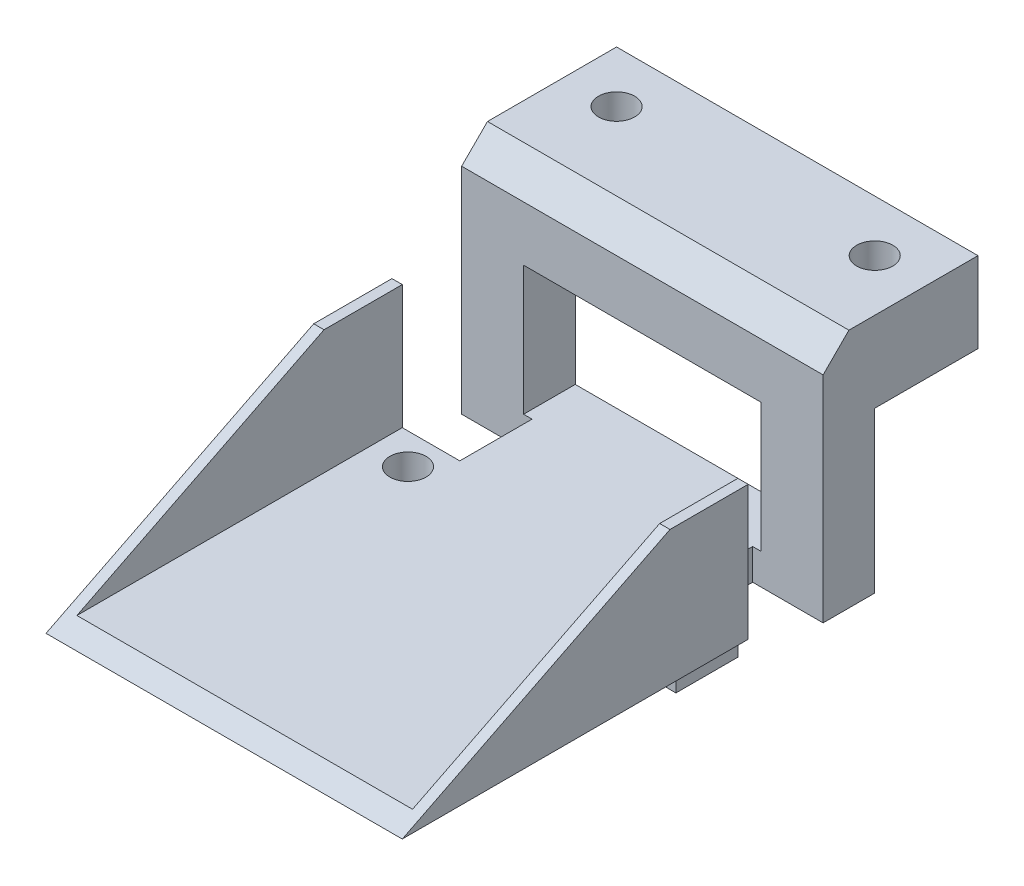
ISO-10303-21;
HEADER;
FILE_DESCRIPTION(('STEP AP214'),'2;1');
FILE_NAME('part.step','',(''),(''),'','','');
FILE_SCHEMA(('AUTOMOTIVE_DESIGN { 1 0 10303 214 1 1 1 1 }'));
ENDSEC;
DATA;
#1=APPLICATION_CONTEXT('core data for automotive mechanical design processes');
#2=APPLICATION_PROTOCOL_DEFINITION('international standard','automotive_design',2000,#1);
#3=PRODUCT_CONTEXT('',#1,'mechanical');
#4=PRODUCT('Part','Part','',(#3));
#5=PRODUCT_RELATED_PRODUCT_CATEGORY('part','',(#4));
#6=PRODUCT_DEFINITION_FORMATION('','',#4);
#7=PRODUCT_DEFINITION_CONTEXT('part definition',#1,'design');
#8=PRODUCT_DEFINITION('design','',#6,#7);
#9=PRODUCT_DEFINITION_SHAPE('','',#8);
#10=(LENGTH_UNIT() NAMED_UNIT(*) SI_UNIT(.MILLI.,.METRE.));
#11=(NAMED_UNIT(*) PLANE_ANGLE_UNIT() SI_UNIT($,.RADIAN.));
#12=(NAMED_UNIT(*) SI_UNIT($,.STERADIAN.) SOLID_ANGLE_UNIT());
#13=UNCERTAINTY_MEASURE_WITH_UNIT(LENGTH_MEASURE(1.E-05),#10,'distance_accuracy_value','');
#14=(GEOMETRIC_REPRESENTATION_CONTEXT(3) GLOBAL_UNCERTAINTY_ASSIGNED_CONTEXT((#13)) GLOBAL_UNIT_ASSIGNED_CONTEXT((#10,
#11,#12)) REPRESENTATION_CONTEXT('',''));
#15=CARTESIAN_POINT('',(0.,0.,0.));
#16=DIRECTION('',(0.,0.,1.));
#17=DIRECTION('',(1.,0.,0.));
#18=AXIS2_PLACEMENT_3D('',#15,#16,#17);
#19=CARTESIAN_POINT('',(-16.25,3.,3.));
#20=DIRECTION('',(0.,0.,-1.));
#21=DIRECTION('',(-1.,0.,0.));
#22=AXIS2_PLACEMENT_3D('',#19,#20,#21);
#23=PLANE('',#22);
#24=DIRECTION('',(1.,0.,0.));
#25=VECTOR('',#24,1.);
#26=CARTESIAN_POINT('',(-16.25,1.99999999999999,3.));
#27=LINE('',#26,#25);
#28=CARTESIAN_POINT('',(-16.25,1.99999999999999,3.));
#29=VERTEX_POINT('',#28);
#30=CARTESIAN_POINT('',(16.25,1.99999999999999,3.));
#31=VERTEX_POINT('',#30);
#32=EDGE_CURVE('E816',#29,#31,#27,.T.);
#33=ORIENTED_EDGE('',*,*,#32,.F.);
#34=DIRECTION('',(0.,-1.,0.));
#35=VECTOR('',#34,1.);
#36=CARTESIAN_POINT('',(-16.25,3.,3.));
#37=LINE('',#36,#35);
#38=CARTESIAN_POINT('',(-16.25,0.,3.));
#39=VERTEX_POINT('',#38);
#40=EDGE_CURVE('E396',#29,#39,#37,.T.);
#41=ORIENTED_EDGE('',*,*,#40,.T.);
#42=DIRECTION('',(1.,0.,0.));
#43=VECTOR('',#42,1.);
#44=CARTESIAN_POINT('',(-16.25,0.,3.));
#45=LINE('',#44,#43);
#46=CARTESIAN_POINT('',(16.25,0.,3.));
#47=VERTEX_POINT('',#46);
#48=EDGE_CURVE('E376',#39,#47,#45,.T.);
#49=ORIENTED_EDGE('',*,*,#48,.T.);
#50=DIRECTION('',(0.,-1.,0.));
#51=VECTOR('',#50,1.);
#52=CARTESIAN_POINT('',(16.25,3.,3.));
#53=LINE('',#52,#51);
#54=EDGE_CURVE('E383',#31,#47,#53,.T.);
#55=ORIENTED_EDGE('',*,*,#54,.F.);
#56=EDGE_LOOP('',(#33,#41,#49,#55));
#57=FACE_BOUND('',#56,.T.);
#58=ADVANCED_FACE('F35',(#57),#23,.F.);
#59=CARTESIAN_POINT('',(-16.25,0.,0.));
#60=DIRECTION('',(1.,0.,0.));
#61=DIRECTION('',(0.,0.,-1.));
#62=AXIS2_PLACEMENT_3D('',#59,#60,#61);
#63=PLANE('',#62);
#64=DIRECTION('',(0.,0.,-1.));
#65=VECTOR('',#64,1.);
#66=CARTESIAN_POINT('',(-16.25,15.,0.));
#67=LINE('',#66,#65);
#68=CARTESIAN_POINT('',(-16.25,15.,4.57738095238095));
#69=VERTEX_POINT('',#68);
#70=CARTESIAN_POINT('',(-16.25,15.,-3.));
#71=VERTEX_POINT('',#70);
#72=EDGE_CURVE('E809',#69,#71,#67,.T.);
#73=ORIENTED_EDGE('',*,*,#72,.F.);
#74=DIRECTION('',(0.,0.448280611872945,-0.893892886770455));
#75=VECTOR('',#74,1.);
#76=CARTESIAN_POINT('',(-16.25,18.8,-3.));
#77=LINE('',#76,#75);
#78=CARTESIAN_POINT('',(-16.25,3.,28.5059523809524));
#79=VERTEX_POINT('',#78);
#80=EDGE_CURVE('E227',#79,#69,#77,.T.);
#81=ORIENTED_EDGE('',*,*,#80,.F.);
#82=DIRECTION('',(0.,0.,1.));
#83=VECTOR('',#82,1.);
#84=CARTESIAN_POINT('',(-16.25,3.,-3.));
#85=LINE('',#84,#83);
#86=CARTESIAN_POINT('',(-16.25,3.,-3.));
#87=VERTEX_POINT('',#86);
#88=EDGE_CURVE('E380',#87,#79,#85,.T.);
#89=ORIENTED_EDGE('',*,*,#88,.F.);
#90=DIRECTION('',(0.,-1.,0.));
#91=VECTOR('',#90,1.);
#92=CARTESIAN_POINT('',(-16.25,1.99999999999999,-3.));
#93=LINE('',#92,#91);
#94=EDGE_CURVE('E238',#71,#87,#93,.T.);
#95=ORIENTED_EDGE('',*,*,#94,.F.);
#96=EDGE_LOOP('',(#73,#81,#89,#95));
#97=FACE_BOUND('',#96,.T.);
#98=ADVANCED_FACE('F509',(#97),#63,.T.);
#99=CARTESIAN_POINT('',(16.25,0.,0.));
#100=DIRECTION('',(-1.,0.,0.));
#101=DIRECTION('',(0.,0.,-1.));
#102=AXIS2_PLACEMENT_3D('',#99,#100,#101);
#103=PLANE('',#102);
#104=DIRECTION('',(0.,0.,1.));
#105=VECTOR('',#104,1.);
#106=CARTESIAN_POINT('',(16.25,15.,0.));
#107=LINE('',#106,#105);
#108=CARTESIAN_POINT('',(16.25,15.,-3.));
#109=VERTEX_POINT('',#108);
#110=CARTESIAN_POINT('',(16.25,15.,4.57738095238095));
#111=VERTEX_POINT('',#110);
#112=EDGE_CURVE('E804',#109,#111,#107,.T.);
#113=ORIENTED_EDGE('',*,*,#112,.F.);
#114=DIRECTION('',(0.,-1.,0.));
#115=VECTOR('',#114,1.);
#116=CARTESIAN_POINT('',(16.25,1.99999999999999,-3.));
#117=LINE('',#116,#115);
#118=CARTESIAN_POINT('',(16.25,3.,-3.));
#119=VERTEX_POINT('',#118);
#120=EDGE_CURVE('E806',#109,#119,#117,.T.);
#121=ORIENTED_EDGE('',*,*,#120,.T.);
#122=DIRECTION('',(0.,0.,-1.));
#123=VECTOR('',#122,1.);
#124=CARTESIAN_POINT('',(16.25,3.,-3.));
#125=LINE('',#124,#123);
#126=CARTESIAN_POINT('',(16.25,3.,28.5059523809524));
#127=VERTEX_POINT('',#126);
#128=EDGE_CURVE('E372',#127,#119,#125,.T.);
#129=ORIENTED_EDGE('',*,*,#128,.F.);
#130=DIRECTION('',(0.,0.448280611872945,-0.893892886770455));
#131=VECTOR('',#130,1.);
#132=CARTESIAN_POINT('',(16.25,18.8,-3.));
#133=LINE('',#132,#131);
#134=EDGE_CURVE('E808',#127,#111,#133,.T.);
#135=ORIENTED_EDGE('',*,*,#134,.T.);
#136=EDGE_LOOP('',(#113,#121,#129,#135));
#137=FACE_BOUND('',#136,.T.);
#138=ADVANCED_FACE('F514',(#137),#103,.T.);
#139=CARTESIAN_POINT('',(-16.25,3.,-3.));
#140=DIRECTION('',(1.,0.,0.));
#141=DIRECTION('',(0.,0.,-1.));
#142=AXIS2_PLACEMENT_3D('',#139,#140,#141);
#143=PLANE('',#142);
#144=DIRECTION('',(0.,0.,1.));
#145=VECTOR('',#144,1.);
#146=CARTESIAN_POINT('',(-16.25,2.,30.5));
#147=LINE('',#146,#145);
#148=CARTESIAN_POINT('',(-16.25,1.99999999999999,-3.));
#149=VERTEX_POINT('',#148);
#150=EDGE_CURVE('E242',#149,#29,#147,.T.);
#151=ORIENTED_EDGE('',*,*,#150,.F.);
#152=DIRECTION('',(0.,-1.,0.));
#153=VECTOR('',#152,1.);
#154=CARTESIAN_POINT('',(-16.25,3.,-3.));
#155=LINE('',#154,#153);
#156=CARTESIAN_POINT('',(-16.25,0.,-3.));
#157=VERTEX_POINT('',#156);
#158=EDGE_CURVE('E398',#149,#157,#155,.T.);
#159=ORIENTED_EDGE('',*,*,#158,.T.);
#160=DIRECTION('',(0.,0.,1.));
#161=VECTOR('',#160,1.);
#162=CARTESIAN_POINT('',(-16.25,0.,-3.));
#163=LINE('',#162,#161);
#164=EDGE_CURVE('E390',#157,#39,#163,.T.);
#165=ORIENTED_EDGE('',*,*,#164,.T.);
#166=ORIENTED_EDGE('',*,*,#40,.F.);
#167=EDGE_LOOP('',(#151,#159,#165,#166));
#168=FACE_BOUND('',#167,.T.);
#169=ADVANCED_FACE('F492',(#168),#143,.F.);
#170=CARTESIAN_POINT('',(0.,3.,0.));
#171=DIRECTION('',(0.,1.,0.));
#172=DIRECTION('',(0.,0.,1.));
#173=AXIS2_PLACEMENT_3D('',#170,#171,#172);
#174=PLANE('',#173);
#175=DIRECTION('',(1.,0.,0.));
#176=VECTOR('',#175,1.);
#177=CARTESIAN_POINT('',(-19.4807455944212,3.,28.5059523809524));
#178=LINE('',#177,#176);
#179=EDGE_CURVE('E828',#79,#127,#178,.T.);
#180=ORIENTED_EDGE('',*,*,#179,.T.);
#181=ORIENTED_EDGE('',*,*,#128,.T.);
#182=DIRECTION('',(-1.,0.,0.));
#183=VECTOR('',#182,1.);
#184=CARTESIAN_POINT('',(-16.25,3.,-3.));
#185=LINE('',#184,#183);
#186=CARTESIAN_POINT('',(10.68,3.,-3.));
#187=VERTEX_POINT('',#186);
#188=EDGE_CURVE('E377',#119,#187,#185,.T.);
#189=ORIENTED_EDGE('',*,*,#188,.T.);
#190=DIRECTION('',(0.,0.,1.));
#191=VECTOR('',#190,1.);
#192=CARTESIAN_POINT('',(10.68,3.,-3.));
#193=LINE('',#192,#191);
#194=CARTESIAN_POINT('',(10.68,3.,-10.));
#195=VERTEX_POINT('',#194);
#196=EDGE_CURVE('E349',#195,#187,#193,.T.);
#197=ORIENTED_EDGE('',*,*,#196,.F.);
#198=DIRECTION('',(-1.,0.,0.));
#199=VECTOR('',#198,1.);
#200=CARTESIAN_POINT('',(-17.5,3.,-10.));
#201=LINE('',#200,#199);
#202=CARTESIAN_POINT('',(11.5,3.,-10.));
#203=VERTEX_POINT('',#202);
#204=EDGE_CURVE('E325',#203,#195,#201,.T.);
#205=ORIENTED_EDGE('',*,*,#204,.F.);
#206=DIRECTION('',(0.,0.,1.));
#207=VECTOR('',#206,1.);
#208=CARTESIAN_POINT('',(11.5,3.,-10.));
#209=LINE('',#208,#207);
#210=CARTESIAN_POINT('',(11.5,3.,-15.));
#211=VERTEX_POINT('',#210);
#212=EDGE_CURVE('E286',#211,#203,#209,.T.);
#213=ORIENTED_EDGE('',*,*,#212,.F.);
#214=DIRECTION('',(1.,0.,0.));
#215=VECTOR('',#214,1.);
#216=CARTESIAN_POINT('',(-10.68,3.,-15.));
#217=LINE('',#216,#215);
#218=CARTESIAN_POINT('',(-11.5,3.,-15.));
#219=VERTEX_POINT('',#218);
#220=EDGE_CURVE('E342',#219,#211,#217,.T.);
#221=ORIENTED_EDGE('',*,*,#220,.F.);
#222=DIRECTION('',(0.,0.,-1.));
#223=VECTOR('',#222,1.);
#224=CARTESIAN_POINT('',(-11.5,3.,-10.));
#225=LINE('',#224,#223);
#226=CARTESIAN_POINT('',(-11.5,3.,-10.));
#227=VERTEX_POINT('',#226);
#228=EDGE_CURVE('E299',#227,#219,#225,.T.);
#229=ORIENTED_EDGE('',*,*,#228,.F.);
#230=CARTESIAN_POINT('',(-10.68,3.,-10.));
#231=VERTEX_POINT('',#230);
#232=EDGE_CURVE('E318',#231,#227,#201,.T.);
#233=ORIENTED_EDGE('',*,*,#232,.F.);
#234=DIRECTION('',(0.,0.,-1.));
#235=VECTOR('',#234,1.);
#236=CARTESIAN_POINT('',(-10.68,3.,-3.));
#237=LINE('',#236,#235);
#238=CARTESIAN_POINT('',(-10.68,3.,-3.));
#239=VERTEX_POINT('',#238);
#240=EDGE_CURVE('E350',#239,#231,#237,.T.);
#241=ORIENTED_EDGE('',*,*,#240,.F.);
#242=EDGE_CURVE('E375',#239,#87,#185,.T.);
#243=ORIENTED_EDGE('',*,*,#242,.T.);
#244=ORIENTED_EDGE('',*,*,#88,.T.);
#245=EDGE_LOOP('',(#180,#181,#189,#197,#205,#213,#221,#229,#233,#241,#243,#244));
#246=FACE_BOUND('',#245,.T.);
#247=CARTESIAN_POINT('',(-12.7,3.,0.));
#248=DIRECTION('',(0.,1.,0.));
#249=DIRECTION('',(0.,0.,1.));
#250=AXIS2_PLACEMENT_3D('',#247,#248,#249);
#251=CIRCLE('',#250,1.75);
#252=CARTESIAN_POINT('',(-12.7,3.,1.75));
#253=VERTEX_POINT('',#252);
#254=EDGE_CURVE('E366',#253,#253,#251,.T.);
#255=ORIENTED_EDGE('',*,*,#254,.F.);
#256=EDGE_LOOP('',(#255));
#257=FACE_BOUND('',#256,.T.);
#258=CARTESIAN_POINT('',(12.7,3.,0.));
#259=DIRECTION('',(0.,1.,0.));
#260=DIRECTION('',(0.,0.,-1.));
#261=AXIS2_PLACEMENT_3D('',#258,#259,#260);
#262=CIRCLE('',#261,1.75);
#263=CARTESIAN_POINT('',(12.7,3.,-1.75));
#264=VERTEX_POINT('',#263);
#265=EDGE_CURVE('E360',#264,#264,#262,.T.);
#266=ORIENTED_EDGE('',*,*,#265,.F.);
#267=EDGE_LOOP('',(#266));
#268=FACE_BOUND('',#267,.T.);
#269=ADVANCED_FACE('F458',(#246,#257,#268),#174,.T.);
#270=CARTESIAN_POINT('',(-16.25,3.,-3.));
#271=DIRECTION('',(0.,0.,1.));
#272=DIRECTION('',(1.,0.,0.));
#273=AXIS2_PLACEMENT_3D('',#270,#271,#272);
#274=PLANE('',#273);
#275=ORIENTED_EDGE('',*,*,#120,.F.);
#276=DIRECTION('',(-1.,0.,0.));
#277=VECTOR('',#276,1.);
#278=CARTESIAN_POINT('',(17.5,15.,-3.));
#279=LINE('',#278,#277);
#280=CARTESIAN_POINT('',(17.25,15.,-3.));
#281=VERTEX_POINT('',#280);
#282=EDGE_CURVE('E228',#281,#109,#279,.T.);
#283=ORIENTED_EDGE('',*,*,#282,.F.);
#284=DIRECTION('',(0.,-1.,0.));
#285=VECTOR('',#284,1.);
#286=CARTESIAN_POINT('',(17.25,1.99999999999999,-3.));
#287=LINE('',#286,#285);
#288=CARTESIAN_POINT('',(17.25,1.99999999999999,-3.));
#289=VERTEX_POINT('',#288);
#290=EDGE_CURVE('E821',#281,#289,#287,.T.);
#291=ORIENTED_EDGE('',*,*,#290,.T.);
#292=DIRECTION('',(-1.,0.,0.));
#293=VECTOR('',#292,1.);
#294=CARTESIAN_POINT('',(17.25,1.99999999999999,-3.));
#295=LINE('',#294,#293);
#296=CARTESIAN_POINT('',(16.25,1.99999999999999,-3.));
#297=VERTEX_POINT('',#296);
#298=EDGE_CURVE('E245',#289,#297,#295,.T.);
#299=ORIENTED_EDGE('',*,*,#298,.T.);
#300=DIRECTION('',(0.,-1.,0.));
#301=VECTOR('',#300,1.);
#302=CARTESIAN_POINT('',(16.25,3.,-3.));
#303=LINE('',#302,#301);
#304=CARTESIAN_POINT('',(16.25,0.,-3.));
#305=VERTEX_POINT('',#304);
#306=EDGE_CURVE('E400',#297,#305,#303,.T.);
#307=ORIENTED_EDGE('',*,*,#306,.T.);
#308=DIRECTION('',(-1.,0.,0.));
#309=VECTOR('',#308,1.);
#310=CARTESIAN_POINT('',(-16.25,0.,-3.));
#311=LINE('',#310,#309);
#312=CARTESIAN_POINT('',(10.68,0.,-3.));
#313=VERTEX_POINT('',#312);
#314=EDGE_CURVE('E387',#305,#313,#311,.T.);
#315=ORIENTED_EDGE('',*,*,#314,.T.);
#316=DIRECTION('',(0.,-1.,0.));
#317=VECTOR('',#316,1.);
#318=CARTESIAN_POINT('',(10.68,27.4999918367333,-3.));
#319=LINE('',#318,#317);
#320=EDGE_CURVE('E355',#187,#313,#319,.T.);
#321=ORIENTED_EDGE('',*,*,#320,.F.);
#322=ORIENTED_EDGE('',*,*,#188,.F.);
#323=EDGE_LOOP('',(#275,#283,#291,#299,#307,#315,#321,#322));
#324=FACE_BOUND('',#323,.T.);
#325=ADVANCED_FACE('F475',(#324),#274,.F.);
#326=CARTESIAN_POINT('',(0.,0.,0.));
#327=DIRECTION('',(0.,1.,0.));
#328=DIRECTION('',(0.,0.,1.));
#329=AXIS2_PLACEMENT_3D('',#326,#327,#328);
#330=PLANE('',#329);
#331=DIRECTION('',(0.,0.,-1.));
#332=VECTOR('',#331,1.);
#333=CARTESIAN_POINT('',(-10.68,0.,-3.));
#334=LINE('',#333,#332);
#335=CARTESIAN_POINT('',(-10.68,0.,-3.));
#336=VERTEX_POINT('',#335);
#337=CARTESIAN_POINT('',(-10.68,0.,-10.));
#338=VERTEX_POINT('',#337);
#339=EDGE_CURVE('E339',#336,#338,#334,.T.);
#340=ORIENTED_EDGE('',*,*,#339,.T.);
#341=DIRECTION('',(-1.,0.,0.));
#342=VECTOR('',#341,1.);
#343=CARTESIAN_POINT('',(-17.5,0.,-10.));
#344=LINE('',#343,#342);
#345=CARTESIAN_POINT('',(-17.5,0.,-10.));
#346=VERTEX_POINT('',#345);
#347=EDGE_CURVE('E322',#338,#346,#344,.T.);
#348=ORIENTED_EDGE('',*,*,#347,.T.);
#349=DIRECTION('',(0.,0.,-1.));
#350=VECTOR('',#349,1.);
#351=CARTESIAN_POINT('',(-17.5,0.,-10.));
#352=LINE('',#351,#350);
#353=CARTESIAN_POINT('',(-17.5,0.,-15.));
#354=VERTEX_POINT('',#353);
#355=EDGE_CURVE('E315',#346,#354,#352,.T.);
#356=ORIENTED_EDGE('',*,*,#355,.T.);
#357=DIRECTION('',(1.,0.,0.));
#358=VECTOR('',#357,1.);
#359=CARTESIAN_POINT('',(-10.68,0.,-15.));
#360=LINE('',#359,#358);
#361=CARTESIAN_POINT('',(17.5,0.,-15.));
#362=VERTEX_POINT('',#361);
#363=EDGE_CURVE('E343',#354,#362,#360,.T.);
#364=ORIENTED_EDGE('',*,*,#363,.T.);
#365=DIRECTION('',(0.,0.,1.));
#366=VECTOR('',#365,1.);
#367=CARTESIAN_POINT('',(17.5,0.,-10.));
#368=LINE('',#367,#366);
#369=CARTESIAN_POINT('',(17.5,0.,-10.));
#370=VERTEX_POINT('',#369);
#371=EDGE_CURVE('E314',#362,#370,#368,.T.);
#372=ORIENTED_EDGE('',*,*,#371,.T.);
#373=CARTESIAN_POINT('',(10.68,0.,-10.));
#374=VERTEX_POINT('',#373);
#375=EDGE_CURVE('E319',#370,#374,#344,.T.);
#376=ORIENTED_EDGE('',*,*,#375,.T.);
#377=DIRECTION('',(0.,0.,1.));
#378=VECTOR('',#377,1.);
#379=CARTESIAN_POINT('',(10.68,0.,-3.));
#380=LINE('',#379,#378);
#381=EDGE_CURVE('E340',#374,#313,#380,.T.);
#382=ORIENTED_EDGE('',*,*,#381,.T.);
#383=ORIENTED_EDGE('',*,*,#314,.F.);
#384=DIRECTION('',(0.,0.,-1.));
#385=VECTOR('',#384,1.);
#386=CARTESIAN_POINT('',(16.25,0.,-3.));
#387=LINE('',#386,#385);
#388=EDGE_CURVE('E369',#47,#305,#387,.T.);
#389=ORIENTED_EDGE('',*,*,#388,.F.);
#390=ORIENTED_EDGE('',*,*,#48,.F.);
#391=ORIENTED_EDGE('',*,*,#164,.F.);
#392=EDGE_CURVE('E386',#336,#157,#311,.T.);
#393=ORIENTED_EDGE('',*,*,#392,.F.);
#394=EDGE_LOOP('',(#340,#348,#356,#364,#372,#376,#382,#383,#389,#390,#391,#393));
#395=FACE_BOUND('',#394,.T.);
#396=CARTESIAN_POINT('',(-12.7,0.,0.));
#397=DIRECTION('',(0.,1.,0.));
#398=DIRECTION('',(0.,0.,1.));
#399=AXIS2_PLACEMENT_3D('',#396,#397,#398);
#400=CIRCLE('',#399,1.75);
#401=CARTESIAN_POINT('',(-12.7,0.,1.75));
#402=VERTEX_POINT('',#401);
#403=EDGE_CURVE('E363',#402,#402,#400,.T.);
#404=ORIENTED_EDGE('',*,*,#403,.T.);
#405=EDGE_LOOP('',(#404));
#406=FACE_BOUND('',#405,.T.);
#407=CARTESIAN_POINT('',(12.7,0.,0.));
#408=DIRECTION('',(0.,1.,0.));
#409=DIRECTION('',(0.,0.,-1.));
#410=AXIS2_PLACEMENT_3D('',#407,#408,#409);
#411=CIRCLE('',#410,1.75);
#412=CARTESIAN_POINT('',(12.7,0.,-1.75));
#413=VERTEX_POINT('',#412);
#414=EDGE_CURVE('E352',#413,#413,#411,.T.);
#415=ORIENTED_EDGE('',*,*,#414,.T.);
#416=EDGE_LOOP('',(#415));
#417=FACE_BOUND('',#416,.T.);
#418=ADVANCED_FACE('F436',(#395,#406,#417),#330,.F.);
#419=CARTESIAN_POINT('',(16.25,3.,-3.));
#420=DIRECTION('',(-1.,0.,0.));
#421=DIRECTION('',(0.,0.,1.));
#422=AXIS2_PLACEMENT_3D('',#419,#420,#421);
#423=PLANE('',#422);
#424=ORIENTED_EDGE('',*,*,#306,.F.);
#425=DIRECTION('',(0.,0.,1.));
#426=VECTOR('',#425,1.);
#427=CARTESIAN_POINT('',(16.25,2.,30.5));
#428=LINE('',#427,#426);
#429=EDGE_CURVE('E485',#297,#31,#428,.T.);
#430=ORIENTED_EDGE('',*,*,#429,.T.);
#431=ORIENTED_EDGE('',*,*,#54,.T.);
#432=ORIENTED_EDGE('',*,*,#388,.T.);
#433=EDGE_LOOP('',(#424,#430,#431,#432));
#434=FACE_BOUND('',#433,.T.);
#435=ADVANCED_FACE('F481',(#434),#423,.F.);
#436=DIRECTION('',(0.,-1.,0.));
#437=VECTOR('',#436,1.);
#438=CARTESIAN_POINT('',(-17.25,1.99999999999999,-3.));
#439=LINE('',#438,#437);
#440=CARTESIAN_POINT('',(-17.25,15.,-3.));
#441=VERTEX_POINT('',#440);
#442=CARTESIAN_POINT('',(-17.25,1.99999999999999,-3.));
#443=VERTEX_POINT('',#442);
#444=EDGE_CURVE('E234',#441,#443,#439,.T.);
#445=ORIENTED_EDGE('',*,*,#444,.F.);
#446=EDGE_CURVE('E51',#71,#441,#279,.T.);
#447=ORIENTED_EDGE('',*,*,#446,.F.);
#448=ORIENTED_EDGE('',*,*,#94,.T.);
#449=ORIENTED_EDGE('',*,*,#242,.F.);
#450=DIRECTION('',(0.,-1.,0.));
#451=VECTOR('',#450,1.);
#452=CARTESIAN_POINT('',(-10.68,27.4999918367333,-3.));
#453=LINE('',#452,#451);
#454=EDGE_CURVE('E353',#239,#336,#453,.T.);
#455=ORIENTED_EDGE('',*,*,#454,.T.);
#456=ORIENTED_EDGE('',*,*,#392,.T.);
#457=ORIENTED_EDGE('',*,*,#158,.F.);
#458=DIRECTION('',(1.,0.,0.));
#459=VECTOR('',#458,1.);
#460=CARTESIAN_POINT('',(-17.25,1.99999999999999,-3.));
#461=LINE('',#460,#459);
#462=EDGE_CURVE('E236',#443,#149,#461,.T.);
#463=ORIENTED_EDGE('',*,*,#462,.F.);
#464=EDGE_LOOP('',(#445,#447,#448,#449,#455,#456,#457,#463));
#465=FACE_BOUND('',#464,.T.);
#466=ADVANCED_FACE('F496',(#465),#274,.F.);
#467=CARTESIAN_POINT('',(-12.7,3.,0.));
#468=DIRECTION('',(0.,-1.,0.));
#469=DIRECTION('',(0.,0.,-1.));
#470=AXIS2_PLACEMENT_3D('',#467,#468,#469);
#471=CYLINDRICAL_SURFACE('',#470,1.75);
#472=ORIENTED_EDGE('',*,*,#254,.T.);
#473=EDGE_LOOP('',(#472));
#474=FACE_BOUND('',#473,.T.);
#475=ORIENTED_EDGE('',*,*,#403,.F.);
#476=EDGE_LOOP('',(#475));
#477=FACE_BOUND('',#476,.T.);
#478=ADVANCED_FACE('F523',(#474,#477),#471,.F.);
#479=CARTESIAN_POINT('',(12.7,3.,0.));
#480=DIRECTION('',(0.,-1.,0.));
#481=DIRECTION('',(0.,0.,-1.));
#482=AXIS2_PLACEMENT_3D('',#479,#480,#481);
#483=CYLINDRICAL_SURFACE('',#482,1.75);
#484=ORIENTED_EDGE('',*,*,#265,.T.);
#485=EDGE_LOOP('',(#484));
#486=FACE_BOUND('',#485,.T.);
#487=ORIENTED_EDGE('',*,*,#414,.F.);
#488=EDGE_LOOP('',(#487));
#489=FACE_BOUND('',#488,.T.);
#490=ADVANCED_FACE('F539',(#486,#489),#483,.F.);
#491=CARTESIAN_POINT('',(-10.68,27.4999918367333,-15.));
#492=DIRECTION('',(0.,0.,-1.));
#493=DIRECTION('',(-1.,0.,0.));
#494=AXIS2_PLACEMENT_3D('',#491,#492,#493);
#495=PLANE('',#494);
#496=ORIENTED_EDGE('',*,*,#363,.F.);
#497=DIRECTION('',(0.,-1.,0.));
#498=VECTOR('',#497,1.);
#499=CARTESIAN_POINT('',(-17.5,38.3553390593274,-15.));
#500=LINE('',#499,#498);
#501=CARTESIAN_POINT('',(-17.5,15.5,-15.));
#502=VERTEX_POINT('',#501);
#503=EDGE_CURVE('E332',#502,#354,#500,.T.);
#504=ORIENTED_EDGE('',*,*,#503,.F.);
#505=DIRECTION('',(-1.,0.,0.));
#506=VECTOR('',#505,1.);
#507=CARTESIAN_POINT('',(-17.5,15.5,-15.));
#508=LINE('',#507,#506);
#509=CARTESIAN_POINT('',(-11.5,15.5,-15.));
#510=VERTEX_POINT('',#509);
#511=EDGE_CURVE('E303',#510,#502,#508,.T.);
#512=ORIENTED_EDGE('',*,*,#511,.F.);
#513=DIRECTION('',(0.,-1.,0.));
#514=VECTOR('',#513,1.);
#515=CARTESIAN_POINT('',(-11.5,15.5,-15.));
#516=LINE('',#515,#514);
#517=EDGE_CURVE('E306',#510,#219,#516,.T.);
#518=ORIENTED_EDGE('',*,*,#517,.T.);
#519=ORIENTED_EDGE('',*,*,#220,.T.);
#520=DIRECTION('',(0.,-1.,0.));
#521=VECTOR('',#520,1.);
#522=CARTESIAN_POINT('',(11.5,15.5,-15.));
#523=LINE('',#522,#521);
#524=CARTESIAN_POINT('',(11.5,15.5,-15.));
#525=VERTEX_POINT('',#524);
#526=EDGE_CURVE('E297',#525,#211,#523,.T.);
#527=ORIENTED_EDGE('',*,*,#526,.F.);
#528=DIRECTION('',(-1.,0.,0.));
#529=VECTOR('',#528,1.);
#530=CARTESIAN_POINT('',(17.5,15.5,-15.));
#531=LINE('',#530,#529);
#532=CARTESIAN_POINT('',(17.5,15.5,-15.));
#533=VERTEX_POINT('',#532);
#534=EDGE_CURVE('E287',#533,#525,#531,.T.);
#535=ORIENTED_EDGE('',*,*,#534,.F.);
#536=DIRECTION('',(0.,-1.,0.));
#537=VECTOR('',#536,1.);
#538=CARTESIAN_POINT('',(17.5,38.3553390593274,-15.));
#539=LINE('',#538,#537);
#540=EDGE_CURVE('E328',#533,#362,#539,.T.);
#541=ORIENTED_EDGE('',*,*,#540,.T.);
#542=EDGE_LOOP('',(#496,#504,#512,#518,#519,#527,#535,#541));
#543=FACE_BOUND('',#542,.T.);
#544=ADVANCED_FACE('F442',(#543),#495,.T.);
#545=CARTESIAN_POINT('',(10.68,27.4999918367333,-3.));
#546=DIRECTION('',(1.,0.,0.));
#547=DIRECTION('',(0.,0.,-1.));
#548=AXIS2_PLACEMENT_3D('',#545,#546,#547);
#549=PLANE('',#548);
#550=DIRECTION('',(0.,-1.,0.));
#551=VECTOR('',#550,1.);
#552=CARTESIAN_POINT('',(10.68,27.4999918367333,-10.));
#553=LINE('',#552,#551);
#554=EDGE_CURVE('E337',#195,#374,#553,.T.);
#555=ORIENTED_EDGE('',*,*,#554,.F.);
#556=ORIENTED_EDGE('',*,*,#196,.T.);
#557=ORIENTED_EDGE('',*,*,#320,.T.);
#558=ORIENTED_EDGE('',*,*,#381,.F.);
#559=EDGE_LOOP('',(#555,#556,#557,#558));
#560=FACE_BOUND('',#559,.T.);
#561=ADVANCED_FACE('F472',(#560),#549,.T.);
#562=CARTESIAN_POINT('',(-10.68,27.4999918367333,-3.));
#563=DIRECTION('',(-1.,0.,0.));
#564=DIRECTION('',(0.,0.,1.));
#565=AXIS2_PLACEMENT_3D('',#562,#563,#564);
#566=PLANE('',#565);
#567=DIRECTION('',(0.,1.,0.));
#568=VECTOR('',#567,1.);
#569=CARTESIAN_POINT('',(-10.68,27.4999918367333,-10.));
#570=LINE('',#569,#568);
#571=EDGE_CURVE('E402',#338,#231,#570,.T.);
#572=ORIENTED_EDGE('',*,*,#571,.F.);
#573=ORIENTED_EDGE('',*,*,#339,.F.);
#574=ORIENTED_EDGE('',*,*,#454,.F.);
#575=ORIENTED_EDGE('',*,*,#240,.T.);
#576=EDGE_LOOP('',(#572,#573,#574,#575));
#577=FACE_BOUND('',#576,.T.);
#578=ADVANCED_FACE('F498',(#577),#566,.T.);
#579=CARTESIAN_POINT('',(-17.5,38.3553390593274,-10.));
#580=DIRECTION('',(-1.,0.,0.));
#581=DIRECTION('',(0.,0.,1.));
#582=AXIS2_PLACEMENT_3D('',#579,#580,#581);
#583=PLANE('',#582);
#584=DIRECTION('',(0.,-1.,0.));
#585=VECTOR('',#584,1.);
#586=CARTESIAN_POINT('',(-17.5,38.3553390593274,-10.));
#587=LINE('',#586,#585);
#588=CARTESIAN_POINT('',(-17.5,20.8,-10.));
#589=VERTEX_POINT('',#588);
#590=EDGE_CURVE('E327',#589,#346,#587,.T.);
#591=ORIENTED_EDGE('',*,*,#590,.F.);
#592=DIRECTION('',(0.,-0.707106781186549,0.707106781186547));
#593=VECTOR('',#592,1.);
#594=CARTESIAN_POINT('',(-17.5,29.5776695296637,-18.7776695296637));
#595=LINE('',#594,#593);
#596=CARTESIAN_POINT('',(-17.5,23.3,-12.5));
#597=VERTEX_POINT('',#596);
#598=EDGE_CURVE('E44',#589,#597,#595,.F.);
#599=ORIENTED_EDGE('',*,*,#598,.T.);
#600=DIRECTION('',(0.,0.,1.));
#601=VECTOR('',#600,1.);
#602=CARTESIAN_POINT('',(-17.5,23.3,-10.));
#603=LINE('',#602,#601);
#604=CARTESIAN_POINT('',(-17.5,23.3,-25.));
#605=VERTEX_POINT('',#604);
#606=EDGE_CURVE('E269',#605,#597,#603,.T.);
#607=ORIENTED_EDGE('',*,*,#606,.F.);
#608=DIRECTION('',(0.,-1.,0.));
#609=VECTOR('',#608,1.);
#610=CARTESIAN_POINT('',(-17.5,23.3,-25.));
#611=LINE('',#610,#609);
#612=CARTESIAN_POINT('',(-17.5,15.5,-25.));
#613=VERTEX_POINT('',#612);
#614=EDGE_CURVE('E272',#605,#613,#611,.T.);
#615=ORIENTED_EDGE('',*,*,#614,.T.);
#616=DIRECTION('',(0.,0.,1.));
#617=VECTOR('',#616,1.);
#618=CARTESIAN_POINT('',(-17.5,15.5,-10.));
#619=LINE('',#618,#617);
#620=EDGE_CURVE('E276',#613,#502,#619,.T.);
#621=ORIENTED_EDGE('',*,*,#620,.T.);
#622=ORIENTED_EDGE('',*,*,#503,.T.);
#623=ORIENTED_EDGE('',*,*,#355,.F.);
#624=EDGE_LOOP('',(#591,#599,#607,#615,#621,#622,#623));
#625=FACE_BOUND('',#624,.T.);
#626=ADVANCED_FACE('F415',(#625),#583,.T.);
#627=CARTESIAN_POINT('',(-17.5,38.3553390593274,-10.));
#628=DIRECTION('',(0.,0.,1.));
#629=DIRECTION('',(1.,0.,0.));
#630=AXIS2_PLACEMENT_3D('',#627,#628,#629);
#631=PLANE('',#630);
#632=DIRECTION('',(0.,-1.,0.));
#633=VECTOR('',#632,1.);
#634=CARTESIAN_POINT('',(17.5,38.3553390593274,-10.));
#635=LINE('',#634,#633);
#636=CARTESIAN_POINT('',(17.5,20.8,-10.));
#637=VERTEX_POINT('',#636);
#638=EDGE_CURVE('E331',#637,#370,#635,.T.);
#639=ORIENTED_EDGE('',*,*,#638,.F.);
#640=DIRECTION('',(-1.,0.,0.));
#641=VECTOR('',#640,1.);
#642=CARTESIAN_POINT('',(-17.5,20.8,-10.));
#643=LINE('',#642,#641);
#644=EDGE_CURVE('E410',#637,#589,#643,.T.);
#645=ORIENTED_EDGE('',*,*,#644,.T.);
#646=ORIENTED_EDGE('',*,*,#590,.T.);
#647=ORIENTED_EDGE('',*,*,#347,.F.);
#648=ORIENTED_EDGE('',*,*,#571,.T.);
#649=ORIENTED_EDGE('',*,*,#232,.T.);
#650=DIRECTION('',(0.,-1.,0.));
#651=VECTOR('',#650,1.);
#652=CARTESIAN_POINT('',(-11.5,15.5,-10.));
#653=LINE('',#652,#651);
#654=CARTESIAN_POINT('',(-11.5,15.5,-10.));
#655=VERTEX_POINT('',#654);
#656=EDGE_CURVE('E311',#655,#227,#653,.T.);
#657=ORIENTED_EDGE('',*,*,#656,.F.);
#658=DIRECTION('',(1.,0.,0.));
#659=VECTOR('',#658,1.);
#660=CARTESIAN_POINT('',(17.5,15.5,-10.));
#661=LINE('',#660,#659);
#662=CARTESIAN_POINT('',(11.5,15.5,-10.));
#663=VERTEX_POINT('',#662);
#664=EDGE_CURVE('E267',#655,#663,#661,.T.);
#665=ORIENTED_EDGE('',*,*,#664,.T.);
#666=DIRECTION('',(0.,-1.,0.));
#667=VECTOR('',#666,1.);
#668=CARTESIAN_POINT('',(11.5,15.5,-10.));
#669=LINE('',#668,#667);
#670=EDGE_CURVE('E293',#663,#203,#669,.T.);
#671=ORIENTED_EDGE('',*,*,#670,.T.);
#672=ORIENTED_EDGE('',*,*,#204,.T.);
#673=ORIENTED_EDGE('',*,*,#554,.T.);
#674=ORIENTED_EDGE('',*,*,#375,.F.);
#675=EDGE_LOOP('',(#639,#645,#646,#647,#648,#649,#657,#665,#671,#672,#673,#674));
#676=FACE_BOUND('',#675,.T.);
#677=ADVANCED_FACE('F432',(#676),#631,.T.);
#678=CARTESIAN_POINT('',(17.5,38.3553390593274,-10.));
#679=DIRECTION('',(1.,0.,0.));
#680=DIRECTION('',(0.,0.,-1.));
#681=AXIS2_PLACEMENT_3D('',#678,#679,#680);
#682=PLANE('',#681);
#683=DIRECTION('',(0.,0.,-1.));
#684=VECTOR('',#683,1.);
#685=CARTESIAN_POINT('',(17.5,23.3,-10.));
#686=LINE('',#685,#684);
#687=CARTESIAN_POINT('',(17.5,23.3,-12.5));
#688=VERTEX_POINT('',#687);
#689=CARTESIAN_POINT('',(17.5,23.3,-25.));
#690=VERTEX_POINT('',#689);
#691=EDGE_CURVE('E264',#688,#690,#686,.T.);
#692=ORIENTED_EDGE('',*,*,#691,.F.);
#693=DIRECTION('',(0.,0.707106781186549,-0.707106781186547));
#694=VECTOR('',#693,1.);
#695=CARTESIAN_POINT('',(17.5,29.5776695296637,-18.7776695296637));
#696=LINE('',#695,#694);
#697=EDGE_CURVE('E408',#688,#637,#696,.F.);
#698=ORIENTED_EDGE('',*,*,#697,.T.);
#699=ORIENTED_EDGE('',*,*,#638,.T.);
#700=ORIENTED_EDGE('',*,*,#371,.F.);
#701=ORIENTED_EDGE('',*,*,#540,.F.);
#702=DIRECTION('',(0.,0.,-1.));
#703=VECTOR('',#702,1.);
#704=CARTESIAN_POINT('',(17.5,15.5,-10.));
#705=LINE('',#704,#703);
#706=CARTESIAN_POINT('',(17.5,15.5,-25.));
#707=VERTEX_POINT('',#706);
#708=EDGE_CURVE('E255',#533,#707,#705,.T.);
#709=ORIENTED_EDGE('',*,*,#708,.T.);
#710=DIRECTION('',(0.,-1.,0.));
#711=VECTOR('',#710,1.);
#712=CARTESIAN_POINT('',(17.5,23.3,-25.));
#713=LINE('',#712,#711);
#714=EDGE_CURVE('E283',#690,#707,#713,.T.);
#715=ORIENTED_EDGE('',*,*,#714,.F.);
#716=EDGE_LOOP('',(#692,#698,#699,#700,#701,#709,#715));
#717=FACE_BOUND('',#716,.T.);
#718=ADVANCED_FACE('F427',(#717),#682,.T.);
#719=CARTESIAN_POINT('',(-11.5,15.5,-10.));
#720=DIRECTION('',(-1.,0.,0.));
#721=DIRECTION('',(0.,0.,1.));
#722=AXIS2_PLACEMENT_3D('',#719,#720,#721);
#723=PLANE('',#722);
#724=ORIENTED_EDGE('',*,*,#228,.T.);
#725=ORIENTED_EDGE('',*,*,#517,.F.);
#726=DIRECTION('',(0.,0.,-1.));
#727=VECTOR('',#726,1.);
#728=CARTESIAN_POINT('',(-11.5,15.5,-10.));
#729=LINE('',#728,#727);
#730=EDGE_CURVE('E300',#655,#510,#729,.T.);
#731=ORIENTED_EDGE('',*,*,#730,.F.);
#732=ORIENTED_EDGE('',*,*,#656,.T.);
#733=EDGE_LOOP('',(#724,#725,#731,#732));
#734=FACE_BOUND('',#733,.T.);
#735=ADVANCED_FACE('F464',(#734),#723,.F.);
#736=CARTESIAN_POINT('',(11.5,15.5,-10.));
#737=DIRECTION('',(1.,0.,0.));
#738=DIRECTION('',(0.,0.,-1.));
#739=AXIS2_PLACEMENT_3D('',#736,#737,#738);
#740=PLANE('',#739);
#741=ORIENTED_EDGE('',*,*,#212,.T.);
#742=ORIENTED_EDGE('',*,*,#670,.F.);
#743=DIRECTION('',(0.,0.,1.));
#744=VECTOR('',#743,1.);
#745=CARTESIAN_POINT('',(11.5,15.5,-10.));
#746=LINE('',#745,#744);
#747=EDGE_CURVE('E290',#525,#663,#746,.T.);
#748=ORIENTED_EDGE('',*,*,#747,.F.);
#749=ORIENTED_EDGE('',*,*,#526,.T.);
#750=EDGE_LOOP('',(#741,#742,#748,#749));
#751=FACE_BOUND('',#750,.T.);
#752=ADVANCED_FACE('F719',(#751),#740,.F.);
#753=CARTESIAN_POINT('',(17.5,23.3,-25.));
#754=DIRECTION('',(0.,0.,1.));
#755=DIRECTION('',(1.,0.,0.));
#756=AXIS2_PLACEMENT_3D('',#753,#754,#755);
#757=PLANE('',#756);
#758=DIRECTION('',(-1.,0.,0.));
#759=VECTOR('',#758,1.);
#760=CARTESIAN_POINT('',(17.5,15.5,-25.));
#761=LINE('',#760,#759);
#762=EDGE_CURVE('E274',#707,#613,#761,.T.);
#763=ORIENTED_EDGE('',*,*,#762,.T.);
#764=ORIENTED_EDGE('',*,*,#614,.F.);
#765=DIRECTION('',(-1.,0.,0.));
#766=VECTOR('',#765,1.);
#767=CARTESIAN_POINT('',(17.5,23.3,-25.));
#768=LINE('',#767,#766);
#769=EDGE_CURVE('E266',#690,#605,#768,.T.);
#770=ORIENTED_EDGE('',*,*,#769,.F.);
#771=ORIENTED_EDGE('',*,*,#714,.T.);
#772=EDGE_LOOP('',(#763,#764,#770,#771));
#773=FACE_BOUND('',#772,.T.);
#774=ADVANCED_FACE('F448',(#773),#757,.F.);
#775=CARTESIAN_POINT('',(0.,23.3,0.));
#776=DIRECTION('',(0.,1.,0.));
#777=DIRECTION('',(0.,0.,1.));
#778=AXIS2_PLACEMENT_3D('',#775,#776,#777);
#779=PLANE('',#778);
#780=CARTESIAN_POINT('',(-12.5,23.3,-20.));
#781=DIRECTION('',(0.,-1.,0.));
#782=DIRECTION('',(0.,0.,-1.));
#783=AXIS2_PLACEMENT_3D('',#780,#781,#782);
#784=CIRCLE('',#783,1.75);
#785=CARTESIAN_POINT('',(-12.5,23.3,-21.75));
#786=VERTEX_POINT('',#785);
#787=EDGE_CURVE('E252',#786,#786,#784,.T.);
#788=ORIENTED_EDGE('',*,*,#787,.T.);
#789=EDGE_LOOP('',(#788));
#790=FACE_BOUND('',#789,.T.);
#791=CARTESIAN_POINT('',(12.5,23.3,-20.));
#792=DIRECTION('',(0.,-1.,0.));
#793=DIRECTION('',(0.,0.,1.));
#794=AXIS2_PLACEMENT_3D('',#791,#792,#793);
#795=CIRCLE('',#794,1.75);
#796=CARTESIAN_POINT('',(12.5,23.3,-18.25));
#797=VERTEX_POINT('',#796);
#798=EDGE_CURVE('E259',#797,#797,#795,.T.);
#799=ORIENTED_EDGE('',*,*,#798,.T.);
#800=EDGE_LOOP('',(#799));
#801=FACE_BOUND('',#800,.T.);
#802=ORIENTED_EDGE('',*,*,#606,.T.);
#803=DIRECTION('',(1.,0.,0.));
#804=VECTOR('',#803,1.);
#805=CARTESIAN_POINT('',(0.,23.3,-12.5));
#806=LINE('',#805,#804);
#807=EDGE_CURVE('E405',#597,#688,#806,.T.);
#808=ORIENTED_EDGE('',*,*,#807,.T.);
#809=ORIENTED_EDGE('',*,*,#691,.T.);
#810=ORIENTED_EDGE('',*,*,#769,.T.);
#811=EDGE_LOOP('',(#802,#808,#809,#810));
#812=FACE_BOUND('',#811,.T.);
#813=ADVANCED_FACE('F421',(#790,#801,#812),#779,.T.);
#814=CARTESIAN_POINT('',(0.,15.5,0.));
#815=DIRECTION('',(0.,1.,0.));
#816=DIRECTION('',(0.,0.,1.));
#817=AXIS2_PLACEMENT_3D('',#814,#815,#816);
#818=PLANE('',#817);
#819=CARTESIAN_POINT('',(-12.5,15.5,-20.));
#820=DIRECTION('',(0.,-1.,0.));
#821=DIRECTION('',(0.,0.,-1.));
#822=AXIS2_PLACEMENT_3D('',#819,#820,#821);
#823=CIRCLE('',#822,1.75);
#824=CARTESIAN_POINT('',(-12.5,15.5,-21.75));
#825=VERTEX_POINT('',#824);
#826=EDGE_CURVE('E256',#825,#825,#823,.T.);
#827=ORIENTED_EDGE('',*,*,#826,.F.);
#828=EDGE_LOOP('',(#827));
#829=FACE_BOUND('',#828,.T.);
#830=CARTESIAN_POINT('',(12.5,15.5,-20.));
#831=DIRECTION('',(0.,-1.,0.));
#832=DIRECTION('',(0.,0.,1.));
#833=AXIS2_PLACEMENT_3D('',#830,#831,#832);
#834=CIRCLE('',#833,1.75);
#835=CARTESIAN_POINT('',(12.5,15.5,-18.25));
#836=VERTEX_POINT('',#835);
#837=EDGE_CURVE('E251',#836,#836,#834,.T.);
#838=ORIENTED_EDGE('',*,*,#837,.F.);
#839=EDGE_LOOP('',(#838));
#840=FACE_BOUND('',#839,.T.);
#841=ORIENTED_EDGE('',*,*,#511,.T.);
#842=ORIENTED_EDGE('',*,*,#620,.F.);
#843=ORIENTED_EDGE('',*,*,#762,.F.);
#844=ORIENTED_EDGE('',*,*,#708,.F.);
#845=ORIENTED_EDGE('',*,*,#534,.T.);
#846=ORIENTED_EDGE('',*,*,#747,.T.);
#847=ORIENTED_EDGE('',*,*,#664,.F.);
#848=ORIENTED_EDGE('',*,*,#730,.T.);
#849=EDGE_LOOP('',(#841,#842,#843,#844,#845,#846,#847,#848));
#850=FACE_BOUND('',#849,.T.);
#851=ADVANCED_FACE('F445',(#829,#840,#850),#818,.F.);
#852=CARTESIAN_POINT('',(0.,23.3,-12.5));
#853=DIRECTION('',(0.,-0.707106781186546,-0.707106781186548));
#854=DIRECTION('',(1.,0.,0.));
#855=AXIS2_PLACEMENT_3D('',#852,#853,#854);
#856=PLANE('',#855);
#857=ORIENTED_EDGE('',*,*,#598,.F.);
#858=ORIENTED_EDGE('',*,*,#644,.F.);
#859=ORIENTED_EDGE('',*,*,#697,.F.);
#860=ORIENTED_EDGE('',*,*,#807,.F.);
#861=EDGE_LOOP('',(#857,#858,#859,#860));
#862=FACE_BOUND('',#861,.T.);
#863=ADVANCED_FACE('F38',(#862),#856,.F.);
#864=CARTESIAN_POINT('',(12.5,23.3,-20.));
#865=DIRECTION('',(0.,-1.,0.));
#866=DIRECTION('',(0.,0.,-1.));
#867=AXIS2_PLACEMENT_3D('',#864,#865,#866);
#868=CYLINDRICAL_SURFACE('',#867,1.75);
#869=ORIENTED_EDGE('',*,*,#798,.F.);
#870=EDGE_LOOP('',(#869));
#871=FACE_BOUND('',#870,.T.);
#872=ORIENTED_EDGE('',*,*,#837,.T.);
#873=EDGE_LOOP('',(#872));
#874=FACE_BOUND('',#873,.T.);
#875=ADVANCED_FACE('F684',(#871,#874),#868,.F.);
#876=CARTESIAN_POINT('',(-12.5,23.3,-20.));
#877=DIRECTION('',(0.,-1.,0.));
#878=DIRECTION('',(0.,0.,-1.));
#879=AXIS2_PLACEMENT_3D('',#876,#877,#878);
#880=CYLINDRICAL_SURFACE('',#879,1.75);
#881=ORIENTED_EDGE('',*,*,#787,.F.);
#882=EDGE_LOOP('',(#881));
#883=FACE_BOUND('',#882,.T.);
#884=ORIENTED_EDGE('',*,*,#826,.T.);
#885=EDGE_LOOP('',(#884));
#886=FACE_BOUND('',#885,.T.);
#887=ADVANCED_FACE('F630',(#883,#886),#880,.F.);
#888=CARTESIAN_POINT('',(-17.25,2.,30.5));
#889=DIRECTION('',(0.,1.,0.));
#890=DIRECTION('',(0.,0.,1.));
#891=AXIS2_PLACEMENT_3D('',#888,#889,#890);
#892=PLANE('',#891);
#893=ORIENTED_EDGE('',*,*,#150,.T.);
#894=ORIENTED_EDGE('',*,*,#32,.T.);
#895=ORIENTED_EDGE('',*,*,#429,.F.);
#896=ORIENTED_EDGE('',*,*,#298,.F.);
#897=DIRECTION('',(0.,0.,1.));
#898=VECTOR('',#897,1.);
#899=CARTESIAN_POINT('',(17.25,2.,30.5));
#900=LINE('',#899,#898);
#901=CARTESIAN_POINT('',(17.25,2.,30.5));
#902=VERTEX_POINT('',#901);
#903=EDGE_CURVE('E814',#289,#902,#900,.T.);
#904=ORIENTED_EDGE('',*,*,#903,.T.);
#905=DIRECTION('',(1.,0.,0.));
#906=VECTOR('',#905,1.);
#907=CARTESIAN_POINT('',(-17.25,2.,30.5));
#908=LINE('',#907,#906);
#909=CARTESIAN_POINT('',(-17.25,2.,30.5));
#910=VERTEX_POINT('',#909);
#911=EDGE_CURVE('E249',#910,#902,#908,.T.);
#912=ORIENTED_EDGE('',*,*,#911,.F.);
#913=DIRECTION('',(0.,0.,1.));
#914=VECTOR('',#913,1.);
#915=CARTESIAN_POINT('',(-17.25,2.,30.5));
#916=LINE('',#915,#914);
#917=EDGE_CURVE('E232',#443,#910,#916,.T.);
#918=ORIENTED_EDGE('',*,*,#917,.F.);
#919=ORIENTED_EDGE('',*,*,#462,.T.);
#920=EDGE_LOOP('',(#893,#894,#895,#896,#904,#912,#918,#919));
#921=FACE_BOUND('',#920,.T.);
#922=ADVANCED_FACE('F621',(#921),#892,.F.);
#923=CARTESIAN_POINT('',(-17.25,18.8,-3.));
#924=DIRECTION('',(0.,-0.893892886770455,-0.448280611872945));
#925=DIRECTION('',(0.,0.448280611872945,-0.893892886770456));
#926=AXIS2_PLACEMENT_3D('',#923,#924,#925);
#927=PLANE('',#926);
#928=DIRECTION('',(0.,0.448280611872945,-0.893892886770455));
#929=VECTOR('',#928,1.);
#930=CARTESIAN_POINT('',(17.25,18.8,-3.));
#931=LINE('',#930,#929);
#932=CARTESIAN_POINT('',(17.25,15.,4.57738095238095));
#933=VERTEX_POINT('',#932);
#934=EDGE_CURVE('E819',#902,#933,#931,.T.);
#935=ORIENTED_EDGE('',*,*,#934,.T.);
#936=DIRECTION('',(-1.,0.,0.));
#937=VECTOR('',#936,1.);
#938=CARTESIAN_POINT('',(17.5,15.,4.57738095238095));
#939=LINE('',#938,#937);
#940=EDGE_CURVE('E59',#933,#111,#939,.T.);
#941=ORIENTED_EDGE('',*,*,#940,.T.);
#942=ORIENTED_EDGE('',*,*,#134,.F.);
#943=ORIENTED_EDGE('',*,*,#179,.F.);
#944=ORIENTED_EDGE('',*,*,#80,.T.);
#945=CARTESIAN_POINT('',(-17.25,15.,4.57738095238095));
#946=VERTEX_POINT('',#945);
#947=EDGE_CURVE('E214',#69,#946,#939,.T.);
#948=ORIENTED_EDGE('',*,*,#947,.T.);
#949=DIRECTION('',(0.,0.448280611872945,-0.893892886770455));
#950=VECTOR('',#949,1.);
#951=CARTESIAN_POINT('',(-17.25,18.8,-3.));
#952=LINE('',#951,#950);
#953=EDGE_CURVE('E224',#910,#946,#952,.T.);
#954=ORIENTED_EDGE('',*,*,#953,.F.);
#955=ORIENTED_EDGE('',*,*,#911,.T.);
#956=EDGE_LOOP('',(#935,#941,#942,#943,#944,#948,#954,#955));
#957=FACE_BOUND('',#956,.T.);
#958=ADVANCED_FACE('F223',(#957),#927,.F.);
#959=CARTESIAN_POINT('',(-17.25,0.,0.));
#960=DIRECTION('',(1.,0.,0.));
#961=DIRECTION('',(0.,0.,-1.));
#962=AXIS2_PLACEMENT_3D('',#959,#960,#961);
#963=PLANE('',#962);
#964=ORIENTED_EDGE('',*,*,#953,.T.);
#965=DIRECTION('',(0.,0.,1.));
#966=VECTOR('',#965,1.);
#967=CARTESIAN_POINT('',(-17.25,15.,-3.));
#968=LINE('',#967,#966);
#969=EDGE_CURVE('E211',#441,#946,#968,.T.);
#970=ORIENTED_EDGE('',*,*,#969,.F.);
#971=ORIENTED_EDGE('',*,*,#444,.T.);
#972=ORIENTED_EDGE('',*,*,#917,.T.);
#973=EDGE_LOOP('',(#964,#970,#971,#972));
#974=FACE_BOUND('',#973,.T.);
#975=ADVANCED_FACE('F230',(#974),#963,.F.);
#976=CARTESIAN_POINT('',(17.25,0.,0.));
#977=DIRECTION('',(-1.,0.,0.));
#978=DIRECTION('',(0.,0.,-1.));
#979=AXIS2_PLACEMENT_3D('',#976,#977,#978);
#980=PLANE('',#979);
#981=ORIENTED_EDGE('',*,*,#290,.F.);
#982=DIRECTION('',(0.,0.,1.));
#983=VECTOR('',#982,1.);
#984=CARTESIAN_POINT('',(17.25,15.,0.));
#985=LINE('',#984,#983);
#986=EDGE_CURVE('E11',#281,#933,#985,.T.);
#987=ORIENTED_EDGE('',*,*,#986,.T.);
#988=ORIENTED_EDGE('',*,*,#934,.F.);
#989=ORIENTED_EDGE('',*,*,#903,.F.);
#990=EDGE_LOOP('',(#981,#987,#988,#989));
#991=FACE_BOUND('',#990,.T.);
#992=ADVANCED_FACE('F657',(#991),#980,.F.);
#993=CARTESIAN_POINT('',(17.5,15.,-3.));
#994=DIRECTION('',(0.,-1.,0.));
#995=DIRECTION('',(0.,0.,-1.));
#996=AXIS2_PLACEMENT_3D('',#993,#994,#995);
#997=PLANE('',#996);
#998=ORIENTED_EDGE('',*,*,#112,.T.);
#999=ORIENTED_EDGE('',*,*,#940,.F.);
#1000=ORIENTED_EDGE('',*,*,#986,.F.);
#1001=ORIENTED_EDGE('',*,*,#282,.T.);
#1002=EDGE_LOOP('',(#998,#999,#1000,#1001));
#1003=FACE_BOUND('',#1002,.T.);
#1004=ADVANCED_FACE('F651',(#1003),#997,.F.);
#1005=ORIENTED_EDGE('',*,*,#72,.T.);
#1006=ORIENTED_EDGE('',*,*,#446,.T.);
#1007=ORIENTED_EDGE('',*,*,#969,.T.);
#1008=ORIENTED_EDGE('',*,*,#947,.F.);
#1009=EDGE_LOOP('',(#1005,#1006,#1007,#1008));
#1010=FACE_BOUND('',#1009,.T.);
#1011=ADVANCED_FACE('F213',(#1010),#997,.F.);
#1012=CLOSED_SHELL('',(#58,#98,#138,#169,#269,#325,#418,#435,#466,#478,#490,#544,#561,#578,#626,
#677,#718,#735,#752,#774,#813,#851,#863,#875,#887,#922,#958,#975,#992,#1004,#1011));
#1013=MANIFOLD_SOLID_BREP('B2',#1012);
#1014=ADVANCED_BREP_SHAPE_REPRESENTATION('',(#18,#1013),#14);
#1015=SHAPE_DEFINITION_REPRESENTATION(#9,#1014);
ENDSEC;
END-ISO-10303-21;
